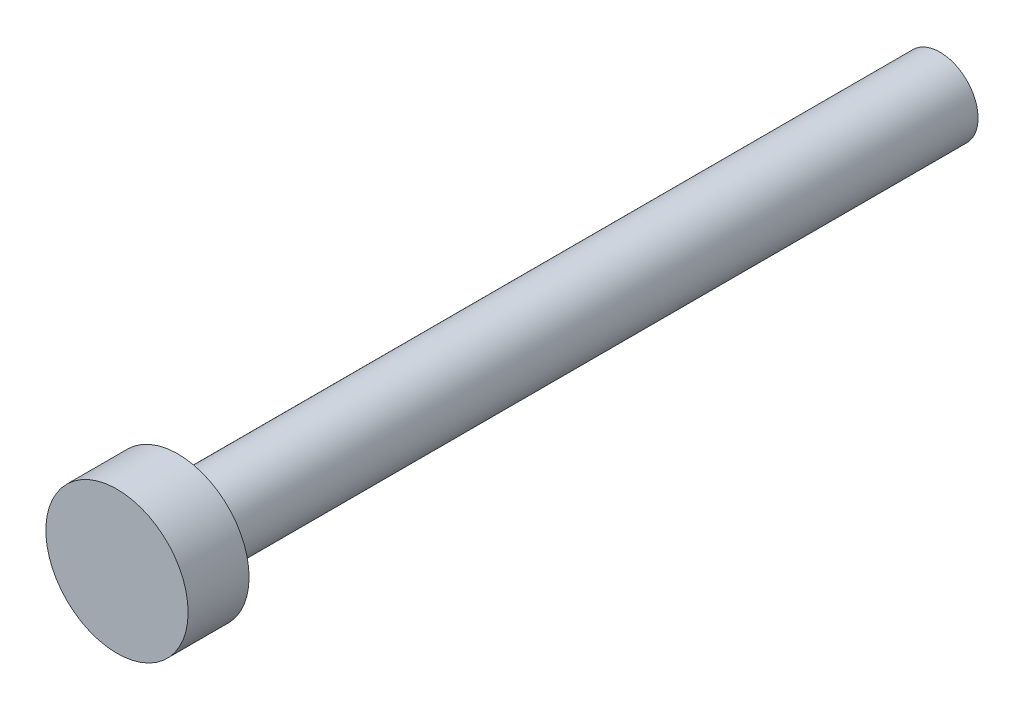
ISO-10303-21;
HEADER;
FILE_DESCRIPTION(('STEP AP214'),'2;1');
FILE_NAME('part.step','',(''),(''),'','','');
FILE_SCHEMA(('AUTOMOTIVE_DESIGN { 1 0 10303 214 1 1 1 1 }'));
ENDSEC;
DATA;
#1=APPLICATION_CONTEXT('core data for automotive mechanical design processes');
#2=APPLICATION_PROTOCOL_DEFINITION('international standard','automotive_design',2000,#1);
#3=PRODUCT_CONTEXT('',#1,'mechanical');
#4=PRODUCT('Part','Part','',(#3));
#5=PRODUCT_RELATED_PRODUCT_CATEGORY('part','',(#4));
#6=PRODUCT_DEFINITION_FORMATION('','',#4);
#7=PRODUCT_DEFINITION_CONTEXT('part definition',#1,'design');
#8=PRODUCT_DEFINITION('design','',#6,#7);
#9=PRODUCT_DEFINITION_SHAPE('','',#8);
#10=(LENGTH_UNIT() NAMED_UNIT(*) SI_UNIT(.MILLI.,.METRE.));
#11=(NAMED_UNIT(*) PLANE_ANGLE_UNIT() SI_UNIT($,.RADIAN.));
#12=(NAMED_UNIT(*) SI_UNIT($,.STERADIAN.) SOLID_ANGLE_UNIT());
#13=UNCERTAINTY_MEASURE_WITH_UNIT(LENGTH_MEASURE(1.E-05),#10,'distance_accuracy_value','');
#14=(GEOMETRIC_REPRESENTATION_CONTEXT(3) GLOBAL_UNCERTAINTY_ASSIGNED_CONTEXT((#13)) GLOBAL_UNIT_ASSIGNED_CONTEXT((#10,
#11,#12)) REPRESENTATION_CONTEXT('',''));
#15=CARTESIAN_POINT('',(0.,0.,0.));
#16=DIRECTION('',(0.,0.,1.));
#17=DIRECTION('',(1.,0.,0.));
#18=AXIS2_PLACEMENT_3D('',#15,#16,#17);
#19=CARTESIAN_POINT('',(0.,0.,2.4));
#20=DIRECTION('',(0.,0.,-1.));
#21=DIRECTION('',(-1.,0.,0.));
#22=AXIS2_PLACEMENT_3D('',#19,#20,#21);
#23=CYLINDRICAL_SURFACE('',#22,2.8);
#24=CARTESIAN_POINT('',(0.,0.,2.4));
#25=DIRECTION('',(0.,0.,1.));
#26=DIRECTION('',(1.,0.,0.));
#27=AXIS2_PLACEMENT_3D('',#24,#25,#26);
#28=CIRCLE('',#27,2.8);
#29=CARTESIAN_POINT('',(2.8,0.,2.4));
#30=VERTEX_POINT('',#29);
#31=EDGE_CURVE('E38',#30,#30,#28,.T.);
#32=ORIENTED_EDGE('',*,*,#31,.F.);
#33=EDGE_LOOP('',(#32));
#34=FACE_BOUND('',#33,.T.);
#35=CARTESIAN_POINT('',(0.,0.,0.));
#36=DIRECTION('',(0.,0.,1.));
#37=DIRECTION('',(1.,0.,0.));
#38=AXIS2_PLACEMENT_3D('',#35,#36,#37);
#39=CIRCLE('',#38,2.8);
#40=CARTESIAN_POINT('',(2.8,0.,0.));
#41=VERTEX_POINT('',#40);
#42=EDGE_CURVE('E34',#41,#41,#39,.T.);
#43=ORIENTED_EDGE('',*,*,#42,.T.);
#44=EDGE_LOOP('',(#43));
#45=FACE_BOUND('',#44,.T.);
#46=ADVANCED_FACE('F31',(#34,#45),#23,.T.);
#47=CARTESIAN_POINT('',(0.,0.,2.4));
#48=DIRECTION('',(0.,0.,1.));
#49=DIRECTION('',(1.,0.,0.));
#50=AXIS2_PLACEMENT_3D('',#47,#48,#49);
#51=PLANE('',#50);
#52=ORIENTED_EDGE('',*,*,#31,.T.);
#53=EDGE_LOOP('',(#52));
#54=FACE_BOUND('',#53,.T.);
#55=ADVANCED_FACE('F55',(#54),#51,.T.);
#56=CARTESIAN_POINT('',(0.,0.,0.));
#57=DIRECTION('',(0.,0.,1.));
#58=DIRECTION('',(1.,0.,0.));
#59=AXIS2_PLACEMENT_3D('',#56,#57,#58);
#60=PLANE('',#59);
#61=CARTESIAN_POINT('',(0.,0.,0.));
#62=DIRECTION('',(0.,0.,-1.));
#63=DIRECTION('',(-1.,0.,0.));
#64=AXIS2_PLACEMENT_3D('',#61,#62,#63);
#65=CIRCLE('',#64,1.5);
#66=CARTESIAN_POINT('',(-1.5,0.,0.));
#67=VERTEX_POINT('',#66);
#68=EDGE_CURVE('E10',#67,#67,#65,.T.);
#69=ORIENTED_EDGE('',*,*,#68,.F.);
#70=EDGE_LOOP('',(#69));
#71=FACE_BOUND('',#70,.T.);
#72=ORIENTED_EDGE('',*,*,#42,.F.);
#73=EDGE_LOOP('',(#72));
#74=FACE_BOUND('',#73,.T.);
#75=ADVANCED_FACE('F52',(#71,#74),#60,.F.);
#76=CARTESIAN_POINT('',(0.,0.,-30.));
#77=DIRECTION('',(0.,0.,1.));
#78=DIRECTION('',(1.,0.,0.));
#79=AXIS2_PLACEMENT_3D('',#76,#77,#78);
#80=CYLINDRICAL_SURFACE('',#79,1.5);
#81=CARTESIAN_POINT('',(0.,0.,-30.));
#82=DIRECTION('',(0.,0.,-1.));
#83=DIRECTION('',(-1.,0.,0.));
#84=AXIS2_PLACEMENT_3D('',#81,#82,#83);
#85=CIRCLE('',#84,1.5);
#86=CARTESIAN_POINT('',(-1.5,0.,-30.));
#87=VERTEX_POINT('',#86);
#88=EDGE_CURVE('E44',#87,#87,#85,.T.);
#89=ORIENTED_EDGE('',*,*,#88,.F.);
#90=EDGE_LOOP('',(#89));
#91=FACE_BOUND('',#90,.T.);
#92=ORIENTED_EDGE('',*,*,#68,.T.);
#93=EDGE_LOOP('',(#92));
#94=FACE_BOUND('',#93,.T.);
#95=ADVANCED_FACE('F54',(#91,#94),#80,.T.);
#96=CARTESIAN_POINT('',(0.,0.,-30.));
#97=DIRECTION('',(0.,0.,-1.));
#98=DIRECTION('',(-1.,0.,0.));
#99=AXIS2_PLACEMENT_3D('',#96,#97,#98);
#100=PLANE('',#99);
#101=ORIENTED_EDGE('',*,*,#88,.T.);
#102=EDGE_LOOP('',(#101));
#103=FACE_BOUND('',#102,.T.);
#104=ADVANCED_FACE('F61',(#103),#100,.T.);
#105=CLOSED_SHELL('',(#46,#55,#75,#95,#104));
#106=MANIFOLD_SOLID_BREP('B2',#105);
#107=ADVANCED_BREP_SHAPE_REPRESENTATION('',(#18,#106),#14);
#108=SHAPE_DEFINITION_REPRESENTATION(#9,#107);
ENDSEC;
END-ISO-10303-21;
